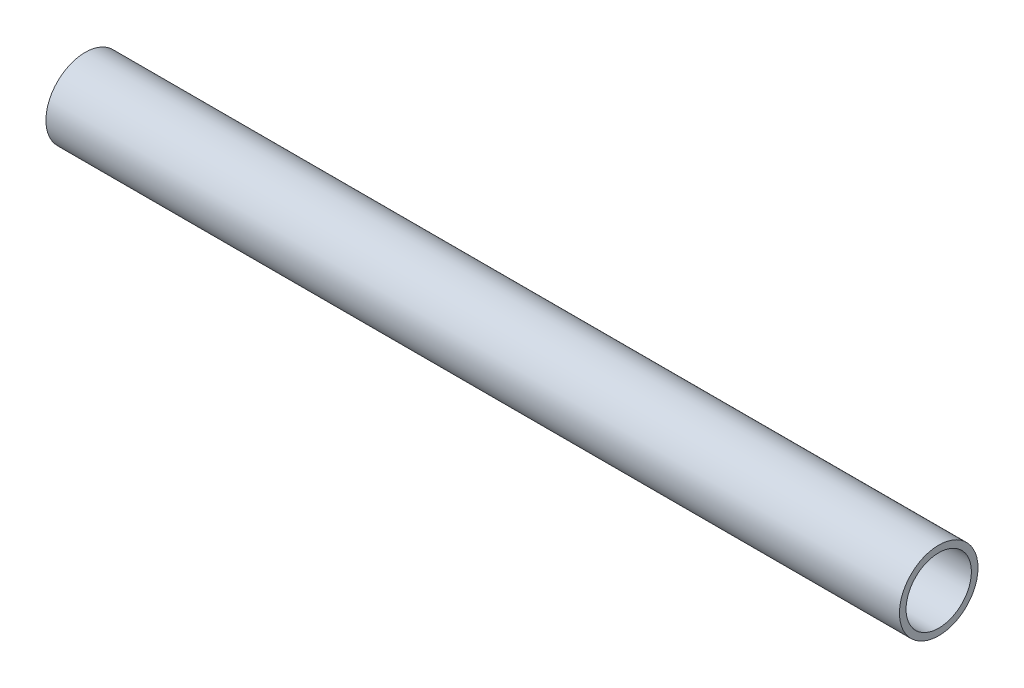
ISO-10303-21;
HEADER;
FILE_DESCRIPTION(('STEP AP214'),'2;1');
FILE_NAME('part.step','',(''),(''),'','','');
FILE_SCHEMA(('AUTOMOTIVE_DESIGN { 1 0 10303 214 1 1 1 1 }'));
ENDSEC;
DATA;
#1=APPLICATION_CONTEXT('core data for automotive mechanical design processes');
#2=APPLICATION_PROTOCOL_DEFINITION('international standard','automotive_design',2000,#1);
#3=PRODUCT_CONTEXT('',#1,'mechanical');
#4=PRODUCT('Part','Part','',(#3));
#5=PRODUCT_RELATED_PRODUCT_CATEGORY('part','',(#4));
#6=PRODUCT_DEFINITION_FORMATION('','',#4);
#7=PRODUCT_DEFINITION_CONTEXT('part definition',#1,'design');
#8=PRODUCT_DEFINITION('design','',#6,#7);
#9=PRODUCT_DEFINITION_SHAPE('','',#8);
#10=(LENGTH_UNIT() NAMED_UNIT(*) SI_UNIT(.MILLI.,.METRE.));
#11=(NAMED_UNIT(*) PLANE_ANGLE_UNIT() SI_UNIT($,.RADIAN.));
#12=(NAMED_UNIT(*) SI_UNIT($,.STERADIAN.) SOLID_ANGLE_UNIT());
#13=UNCERTAINTY_MEASURE_WITH_UNIT(LENGTH_MEASURE(1.E-05),#10,'distance_accuracy_value','');
#14=(GEOMETRIC_REPRESENTATION_CONTEXT(3) GLOBAL_UNCERTAINTY_ASSIGNED_CONTEXT((#13)) GLOBAL_UNIT_ASSIGNED_CONTEXT((#10,
#11,#12)) REPRESENTATION_CONTEXT('',''));
#15=CARTESIAN_POINT('',(0.,0.,0.));
#16=DIRECTION('',(0.,0.,1.));
#17=DIRECTION('',(1.,0.,0.));
#18=AXIS2_PLACEMENT_3D('',#15,#16,#17);
#19=CARTESIAN_POINT('',(31.4791899668123,1471.85967450442,0.));
#20=DIRECTION('',(-1.,0.,0.));
#21=DIRECTION('',(0.,0.,1.));
#22=AXIS2_PLACEMENT_3D('',#19,#20,#21);
#23=CYLINDRICAL_SURFACE('',#22,5.28319999999993);
#24=CARTESIAN_POINT('',(31.4791899668123,1471.85967450442,0.));
#25=DIRECTION('',(1.,0.,0.));
#26=DIRECTION('',(0.,0.,-1.));
#27=AXIS2_PLACEMENT_3D('',#24,#25,#26);
#28=CIRCLE('',#27,5.28319999999993);
#29=CARTESIAN_POINT('',(31.4791899668123,1471.85967450442,-5.28319999999993));
#30=VERTEX_POINT('',#29);
#31=EDGE_CURVE('E55',#30,#30,#28,.T.);
#32=ORIENTED_EDGE('',*,*,#31,.T.);
#33=EDGE_LOOP('',(#32));
#34=FACE_BOUND('',#33,.T.);
#35=CARTESIAN_POINT('',(-106.534019986548,1471.85967450442,0.));
#36=DIRECTION('',(1.,0.,0.));
#37=DIRECTION('',(0.,0.,-1.));
#38=AXIS2_PLACEMENT_3D('',#35,#36,#37);
#39=CIRCLE('',#38,5.28319999999993);
#40=CARTESIAN_POINT('',(-106.534019986548,1471.85967450442,-5.28319999999993));
#41=VERTEX_POINT('',#40);
#42=EDGE_CURVE('E61',#41,#41,#39,.T.);
#43=ORIENTED_EDGE('',*,*,#42,.F.);
#44=EDGE_LOOP('',(#43));
#45=FACE_BOUND('',#44,.T.);
#46=ADVANCED_FACE('F48',(#34,#45),#23,.F.);
#47=CARTESIAN_POINT('',(31.4791899668123,1471.85967450442,0.));
#48=DIRECTION('',(-1.,0.,0.));
#49=DIRECTION('',(0.,0.,1.));
#50=AXIS2_PLACEMENT_3D('',#47,#48,#49);
#51=CYLINDRICAL_SURFACE('',#50,6.34999999999994);
#52=CARTESIAN_POINT('',(31.4791899668123,1471.85967450442,0.));
#53=DIRECTION('',(1.,0.,0.));
#54=DIRECTION('',(0.,0.,-1.));
#55=AXIS2_PLACEMENT_3D('',#52,#53,#54);
#56=CIRCLE('',#55,6.34999999999994);
#57=CARTESIAN_POINT('',(31.4791899668123,1471.85967450442,-6.34999999999994));
#58=VERTEX_POINT('',#57);
#59=EDGE_CURVE('E13',#58,#58,#56,.T.);
#60=ORIENTED_EDGE('',*,*,#59,.F.);
#61=EDGE_LOOP('',(#60));
#62=FACE_BOUND('',#61,.T.);
#63=CARTESIAN_POINT('',(-106.534019986548,1471.85967450442,0.));
#64=DIRECTION('',(1.,0.,0.));
#65=DIRECTION('',(0.,0.,-1.));
#66=AXIS2_PLACEMENT_3D('',#63,#64,#65);
#67=CIRCLE('',#66,6.34999999999994);
#68=CARTESIAN_POINT('',(-106.534019986548,1471.85967450442,-6.34999999999994));
#69=VERTEX_POINT('',#68);
#70=EDGE_CURVE('E51',#69,#69,#67,.T.);
#71=ORIENTED_EDGE('',*,*,#70,.T.);
#72=EDGE_LOOP('',(#71));
#73=FACE_BOUND('',#72,.T.);
#74=ADVANCED_FACE('F68',(#62,#73),#51,.T.);
#75=CARTESIAN_POINT('',(31.4791899668123,1471.85967450442,0.));
#76=DIRECTION('',(1.,0.,0.));
#77=DIRECTION('',(0.,0.,-1.));
#78=AXIS2_PLACEMENT_3D('',#75,#76,#77);
#79=PLANE('',#78);
#80=ORIENTED_EDGE('',*,*,#31,.F.);
#81=EDGE_LOOP('',(#80));
#82=FACE_BOUND('',#81,.T.);
#83=ORIENTED_EDGE('',*,*,#59,.T.);
#84=EDGE_LOOP('',(#83));
#85=FACE_BOUND('',#84,.T.);
#86=ADVANCED_FACE('F72',(#82,#85),#79,.T.);
#87=CARTESIAN_POINT('',(-106.534019986548,1471.85967450442,0.));
#88=DIRECTION('',(1.,0.,0.));
#89=DIRECTION('',(0.,0.,-1.));
#90=AXIS2_PLACEMENT_3D('',#87,#88,#89);
#91=PLANE('',#90);
#92=ORIENTED_EDGE('',*,*,#42,.T.);
#93=EDGE_LOOP('',(#92));
#94=FACE_BOUND('',#93,.T.);
#95=ORIENTED_EDGE('',*,*,#70,.F.);
#96=EDGE_LOOP('',(#95));
#97=FACE_BOUND('',#96,.T.);
#98=ADVANCED_FACE('F70',(#94,#97),#91,.F.);
#99=CLOSED_SHELL('',(#46,#74,#86,#98));
#100=MANIFOLD_SOLID_BREP('B2',#99);
#101=ADVANCED_BREP_SHAPE_REPRESENTATION('',(#18,#100),#14);
#102=SHAPE_DEFINITION_REPRESENTATION(#9,#101);
ENDSEC;
END-ISO-10303-21;
